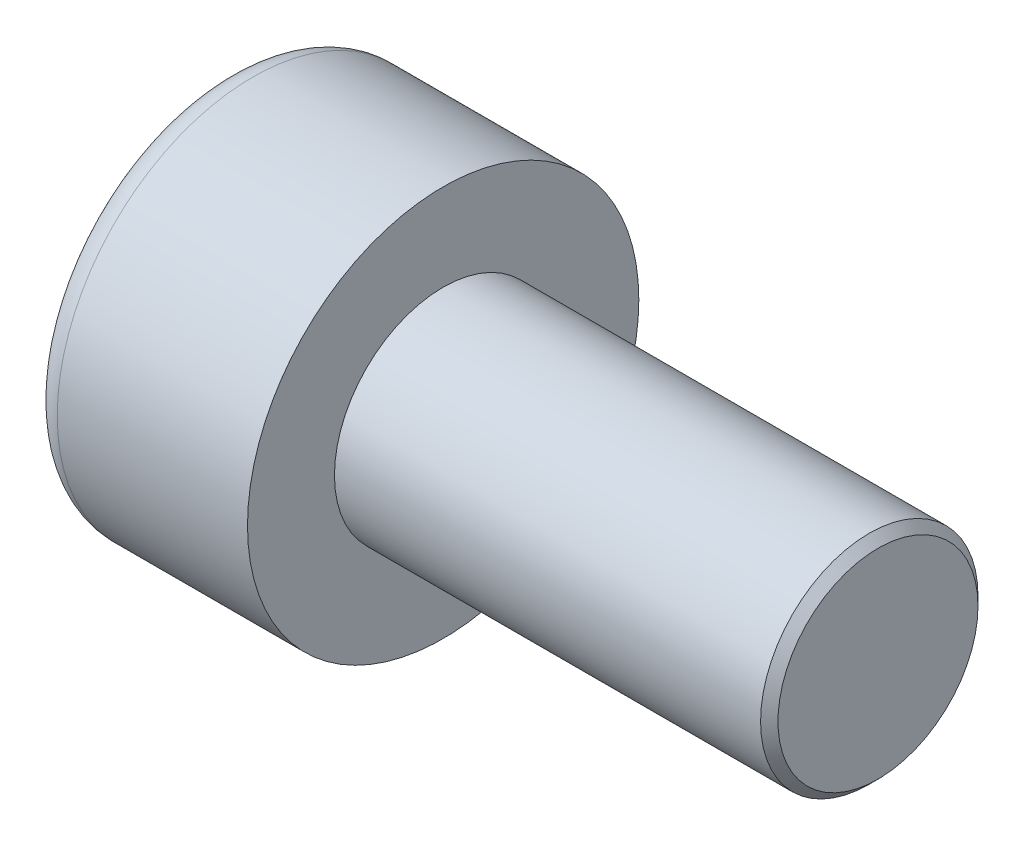
ISO-10303-21;
HEADER;
FILE_DESCRIPTION(('STEP AP214'),'2;1');
FILE_NAME('part.step','',(''),(''),'','','');
FILE_SCHEMA(('AUTOMOTIVE_DESIGN { 1 0 10303 214 1 1 1 1 }'));
ENDSEC;
DATA;
#1=APPLICATION_CONTEXT('core data for automotive mechanical design processes');
#2=APPLICATION_PROTOCOL_DEFINITION('international standard','automotive_design',2000,#1);
#3=PRODUCT_CONTEXT('',#1,'mechanical');
#4=PRODUCT('Part','Part','',(#3));
#5=PRODUCT_RELATED_PRODUCT_CATEGORY('part','',(#4));
#6=PRODUCT_DEFINITION_FORMATION('','',#4);
#7=PRODUCT_DEFINITION_CONTEXT('part definition',#1,'design');
#8=PRODUCT_DEFINITION('design','',#6,#7);
#9=PRODUCT_DEFINITION_SHAPE('','',#8);
#10=(LENGTH_UNIT() NAMED_UNIT(*) SI_UNIT(.MILLI.,.METRE.));
#11=(NAMED_UNIT(*) PLANE_ANGLE_UNIT() SI_UNIT($,.RADIAN.));
#12=(NAMED_UNIT(*) SI_UNIT($,.STERADIAN.) SOLID_ANGLE_UNIT());
#13=UNCERTAINTY_MEASURE_WITH_UNIT(LENGTH_MEASURE(1.E-05),#10,'distance_accuracy_value','');
#14=(GEOMETRIC_REPRESENTATION_CONTEXT(3) GLOBAL_UNCERTAINTY_ASSIGNED_CONTEXT((#13)) GLOBAL_UNIT_ASSIGNED_CONTEXT((#10,
#11,#12)) REPRESENTATION_CONTEXT('',''));
#15=CARTESIAN_POINT('',(0.,0.,0.));
#16=DIRECTION('',(0.,0.,1.));
#17=DIRECTION('',(1.,0.,0.));
#18=AXIS2_PLACEMENT_3D('',#15,#16,#17);
#19=CARTESIAN_POINT('',(1.10000000000003,0.,-1.15470053837931));
#20=DIRECTION('',(1.,0.,0.));
#21=DIRECTION('',(0.,0.,-1.));
#22=AXIS2_PLACEMENT_3D('',#19,#20,#21);
#23=PLANE('',#22);
#24=DIRECTION('',(0.,0.86602540378444,0.500000000000001));
#25=VECTOR('',#24,1.);
#26=CARTESIAN_POINT('',(1.10000000000003,0.,-1.15470053837931));
#27=LINE('',#26,#25);
#28=CARTESIAN_POINT('',(1.10000000000006,0.499999999999966,-0.866025403784443));
#29=VERTEX_POINT('',#28);
#30=CARTESIAN_POINT('',(1.10000000000008,0.999999999999925,-0.577350269189689));
#31=VERTEX_POINT('',#30);
#32=EDGE_CURVE('E394',#29,#31,#27,.T.);
#33=ORIENTED_EDGE('',*,*,#32,.F.);
#34=CARTESIAN_POINT('',(1.10000000000003,0.,0.));
#35=DIRECTION('',(1.,0.,0.));
#36=DIRECTION('',(0.,0.,-1.));
#37=AXIS2_PLACEMENT_3D('',#34,#35,#36);
#38=CIRCLE('',#37,1.);
#39=CARTESIAN_POINT('',(1.10000000000008,0.999999999999925,0.));
#40=VERTEX_POINT('',#39);
#41=EDGE_CURVE('E49',#29,#40,#38,.T.);
#42=ORIENTED_EDGE('',*,*,#41,.T.);
#43=DIRECTION('',(0.,0.,1.));
#44=VECTOR('',#43,1.);
#45=CARTESIAN_POINT('',(1.10000000000008,0.999999999999925,-0.577350269189689));
#46=LINE('',#45,#44);
#47=EDGE_CURVE('E338',#31,#40,#46,.T.);
#48=ORIENTED_EDGE('',*,*,#47,.F.);
#49=EDGE_LOOP('',(#33,#42,#48));
#50=FACE_BOUND('',#49,.T.);
#51=ADVANCED_FACE('F34',(#50),#23,.F.);
#52=CARTESIAN_POINT('',(1.10000000000008,0.999999999999938,0.57735026918955));
#53=VERTEX_POINT('',#52);
#54=EDGE_CURVE('E397',#40,#53,#46,.T.);
#55=ORIENTED_EDGE('',*,*,#54,.F.);
#56=CARTESIAN_POINT('',(1.10000000000004,0.499999999999966,0.866025403784415));
#57=VERTEX_POINT('',#56);
#58=EDGE_CURVE('E197',#40,#57,#38,.T.);
#59=ORIENTED_EDGE('',*,*,#58,.T.);
#60=DIRECTION('',(0.,-0.86602540378444,0.500000000000001));
#61=VECTOR('',#60,1.);
#62=CARTESIAN_POINT('',(1.10000000000008,0.999999999999938,0.57735026918955));
#63=LINE('',#62,#61);
#64=EDGE_CURVE('E337',#53,#57,#63,.T.);
#65=ORIENTED_EDGE('',*,*,#64,.F.);
#66=EDGE_LOOP('',(#55,#59,#65));
#67=FACE_BOUND('',#66,.T.);
#68=ADVANCED_FACE('F123',(#67),#23,.F.);
#69=CARTESIAN_POINT('',(1.10000000000003,0.,1.15470053837927));
#70=VERTEX_POINT('',#69);
#71=EDGE_CURVE('E330',#57,#70,#63,.T.);
#72=ORIENTED_EDGE('',*,*,#71,.F.);
#73=CARTESIAN_POINT('',(1.10000000000003,-0.500000000000065,0.866025403784526));
#74=VERTEX_POINT('',#73);
#75=EDGE_CURVE('E332',#57,#74,#38,.T.);
#76=ORIENTED_EDGE('',*,*,#75,.T.);
#77=DIRECTION('',(0.,-0.86602540378444,-0.500000000000001));
#78=VECTOR('',#77,1.);
#79=CARTESIAN_POINT('',(1.10000000000003,0.,1.15470053837927));
#80=LINE('',#79,#78);
#81=EDGE_CURVE('E335',#70,#74,#80,.T.);
#82=ORIENTED_EDGE('',*,*,#81,.F.);
#83=EDGE_LOOP('',(#72,#76,#82));
#84=FACE_BOUND('',#83,.T.);
#85=ADVANCED_FACE('F128',(#84),#23,.F.);
#86=CARTESIAN_POINT('',(1.10000000000003,-1.00000000000011,0.577350269189703));
#87=VERTEX_POINT('',#86);
#88=EDGE_CURVE('E346',#74,#87,#80,.T.);
#89=ORIENTED_EDGE('',*,*,#88,.F.);
#90=CARTESIAN_POINT('',(1.10000000000003,-1.00000000000008,0.));
#91=VERTEX_POINT('',#90);
#92=EDGE_CURVE('E402',#74,#91,#38,.T.);
#93=ORIENTED_EDGE('',*,*,#92,.T.);
#94=DIRECTION('',(0.,0.,-1.));
#95=VECTOR('',#94,1.);
#96=CARTESIAN_POINT('',(1.10000000000003,-1.00000000000011,0.577350269189703));
#97=LINE('',#96,#95);
#98=EDGE_CURVE('E352',#87,#91,#97,.T.);
#99=ORIENTED_EDGE('',*,*,#98,.F.);
#100=EDGE_LOOP('',(#89,#93,#99));
#101=FACE_BOUND('',#100,.T.);
#102=ADVANCED_FACE('F298',(#101),#23,.F.);
#103=CARTESIAN_POINT('',(1.10000000000003,-1.00000000000008,-0.577350269189578));
#104=VERTEX_POINT('',#103);
#105=EDGE_CURVE('E351',#91,#104,#97,.T.);
#106=ORIENTED_EDGE('',*,*,#105,.F.);
#107=CARTESIAN_POINT('',(1.10000000000003,-0.500000000000078,-0.86602540378436));
#108=VERTEX_POINT('',#107);
#109=EDGE_CURVE('E188',#91,#108,#38,.T.);
#110=ORIENTED_EDGE('',*,*,#109,.T.);
#111=DIRECTION('',(0.,0.866025403784439,-0.500000000000001));
#112=VECTOR('',#111,1.);
#113=CARTESIAN_POINT('',(1.10000000000003,-1.00000000000008,-0.577350269189578));
#114=LINE('',#113,#112);
#115=EDGE_CURVE('E392',#104,#108,#114,.T.);
#116=ORIENTED_EDGE('',*,*,#115,.F.);
#117=EDGE_LOOP('',(#106,#110,#116));
#118=FACE_BOUND('',#117,.T.);
#119=ADVANCED_FACE('F121',(#118),#23,.F.);
#120=CARTESIAN_POINT('',(0.,0.,0.));
#121=DIRECTION('',(1.,0.,0.));
#122=DIRECTION('',(0.,0.,-1.));
#123=AXIS2_PLACEMENT_3D('',#120,#121,#122);
#124=PLANE('',#123);
#125=CARTESIAN_POINT('',(0.,0.,0.));
#126=DIRECTION('',(1.,0.,0.));
#127=DIRECTION('',(0.,0.,-1.));
#128=AXIS2_PLACEMENT_3D('',#125,#126,#127);
#129=CIRCLE('',#128,1.9375);
#130=CARTESIAN_POINT('',(0.,0.,-1.93749999999999));
#131=VERTEX_POINT('',#130);
#132=EDGE_CURVE('E196',#131,#131,#129,.F.);
#133=ORIENTED_EDGE('',*,*,#132,.T.);
#134=EDGE_LOOP('',(#133));
#135=FACE_BOUND('',#134,.T.);
#136=DIRECTION('',(0.,0.866025403784439,-0.500000000000001));
#137=VECTOR('',#136,1.);
#138=CARTESIAN_POINT('',(0.,-1.00000000000006,-0.577350269189481));
#139=LINE('',#138,#137);
#140=CARTESIAN_POINT('',(0.,-1.00000000000006,-0.577350269189481));
#141=VERTEX_POINT('',#140);
#142=CARTESIAN_POINT('',(0.,0.,-1.15470053837924));
#143=VERTEX_POINT('',#142);
#144=EDGE_CURVE('E57',#141,#143,#139,.T.);
#145=ORIENTED_EDGE('',*,*,#144,.T.);
#146=DIRECTION('',(0.,0.86602540378444,0.500000000000001));
#147=VECTOR('',#146,1.);
#148=CARTESIAN_POINT('',(0.,0.,-1.15470053837924));
#149=LINE('',#148,#147);
#150=CARTESIAN_POINT('',(0.,0.999999999999942,-0.577350269189661));
#151=VERTEX_POINT('',#150);
#152=EDGE_CURVE('E357',#143,#151,#149,.T.);
#153=ORIENTED_EDGE('',*,*,#152,.T.);
#154=DIRECTION('',(0.,0.,1.));
#155=VECTOR('',#154,1.);
#156=CARTESIAN_POINT('',(0.,0.999999999999942,-0.577350269189661));
#157=LINE('',#156,#155);
#158=CARTESIAN_POINT('',(0.,1.00000000000001,0.577350269189633));
#159=VERTEX_POINT('',#158);
#160=EDGE_CURVE('E360',#151,#159,#157,.T.);
#161=ORIENTED_EDGE('',*,*,#160,.T.);
#162=DIRECTION('',(0.,-0.86602540378444,0.500000000000001));
#163=VECTOR('',#162,1.);
#164=CARTESIAN_POINT('',(0.,1.00000000000001,0.577350269189633));
#165=LINE('',#164,#163);
#166=CARTESIAN_POINT('',(0.,0.,1.15470053837927));
#167=VERTEX_POINT('',#166);
#168=EDGE_CURVE('E363',#159,#167,#165,.T.);
#169=ORIENTED_EDGE('',*,*,#168,.T.);
#170=DIRECTION('',(0.,-0.86602540378444,-0.500000000000001));
#171=VECTOR('',#170,1.);
#172=CARTESIAN_POINT('',(0.,0.,1.15470053837927));
#173=LINE('',#172,#171);
#174=CARTESIAN_POINT('',(0.,-1.00000000000002,0.577350269189703));
#175=VERTEX_POINT('',#174);
#176=EDGE_CURVE('E366',#167,#175,#173,.T.);
#177=ORIENTED_EDGE('',*,*,#176,.T.);
#178=DIRECTION('',(0.,0.,-1.));
#179=VECTOR('',#178,1.);
#180=CARTESIAN_POINT('',(0.,-1.00000000000002,0.577350269189703));
#181=LINE('',#180,#179);
#182=EDGE_CURVE('E369',#175,#141,#181,.T.);
#183=ORIENTED_EDGE('',*,*,#182,.T.);
#184=EDGE_LOOP('',(#145,#153,#161,#169,#177,#183));
#185=FACE_BOUND('',#184,.T.);
#186=ADVANCED_FACE('F166',(#135,#185),#124,.F.);
#187=CARTESIAN_POINT('',(2.50000000000004,0.,0.));
#188=DIRECTION('',(1.,0.,0.));
#189=DIRECTION('',(0.,0.,-1.));
#190=AXIS2_PLACEMENT_3D('',#187,#188,#189);
#191=PLANE('',#190);
#192=CARTESIAN_POINT('',(2.50000000000004,0.,0.));
#193=DIRECTION('',(1.,0.,0.));
#194=DIRECTION('',(0.,0.,-1.));
#195=AXIS2_PLACEMENT_3D('',#192,#193,#194);
#196=CIRCLE('',#195,2.25);
#197=CARTESIAN_POINT('',(2.50000000000004,0.,-2.25));
#198=VERTEX_POINT('',#197);
#199=EDGE_CURVE('E181',#198,#198,#196,.T.);
#200=ORIENTED_EDGE('',*,*,#199,.T.);
#201=EDGE_LOOP('',(#200));
#202=FACE_BOUND('',#201,.T.);
#203=CARTESIAN_POINT('',(2.50000000000004,0.,0.));
#204=DIRECTION('',(1.,0.,0.));
#205=DIRECTION('',(0.,0.,-1.));
#206=AXIS2_PLACEMENT_3D('',#203,#204,#205);
#207=CIRCLE('',#206,1.25);
#208=CARTESIAN_POINT('',(2.50000000000004,0.,-1.25));
#209=VERTEX_POINT('',#208);
#210=EDGE_CURVE('E184',#209,#209,#207,.T.);
#211=ORIENTED_EDGE('',*,*,#210,.F.);
#212=EDGE_LOOP('',(#211));
#213=FACE_BOUND('',#212,.T.);
#214=ADVANCED_FACE('F163',(#202,#213),#191,.T.);
#215=CARTESIAN_POINT('',(2.50000000000004,0.,0.));
#216=DIRECTION('',(-1.,0.,0.));
#217=DIRECTION('',(0.,0.,1.));
#218=AXIS2_PLACEMENT_3D('',#215,#216,#217);
#219=CYLINDRICAL_SURFACE('',#218,2.25);
#220=CARTESIAN_POINT('',(0.312500000000035,0.,0.));
#221=DIRECTION('',(1.,0.,0.));
#222=DIRECTION('',(0.,0.,-1.));
#223=AXIS2_PLACEMENT_3D('',#220,#221,#222);
#224=CIRCLE('',#223,2.25);
#225=CARTESIAN_POINT('',(0.312500000000035,0.,-2.25));
#226=VERTEX_POINT('',#225);
#227=EDGE_CURVE('E178',#226,#226,#224,.T.);
#228=ORIENTED_EDGE('',*,*,#227,.T.);
#229=EDGE_LOOP('',(#228));
#230=FACE_BOUND('',#229,.T.);
#231=ORIENTED_EDGE('',*,*,#199,.F.);
#232=EDGE_LOOP('',(#231));
#233=FACE_BOUND('',#232,.T.);
#234=ADVANCED_FACE('F161',(#230,#233),#219,.T.);
#235=CARTESIAN_POINT('',(7.50000000000003,0.,2.91433543964104E-13));
#236=DIRECTION('',(-1.,0.,0.));
#237=DIRECTION('',(0.,0.,1.));
#238=AXIS2_PLACEMENT_3D('',#235,#236,#237);
#239=CYLINDRICAL_SURFACE('',#238,1.25);
#240=CARTESIAN_POINT('',(7.40000000000003,0.,2.91433543964104E-13));
#241=DIRECTION('',(1.,0.,0.));
#242=DIRECTION('',(0.,0.,-1.));
#243=AXIS2_PLACEMENT_3D('',#240,#241,#242);
#244=CIRCLE('',#243,1.25);
#245=CARTESIAN_POINT('',(7.40000000000003,0.,-1.24999999999971));
#246=VERTEX_POINT('',#245);
#247=EDGE_CURVE('E11',#246,#246,#244,.F.);
#248=ORIENTED_EDGE('',*,*,#247,.T.);
#249=EDGE_LOOP('',(#248));
#250=FACE_BOUND('',#249,.T.);
#251=ORIENTED_EDGE('',*,*,#210,.T.);
#252=EDGE_LOOP('',(#251));
#253=FACE_BOUND('',#252,.T.);
#254=ADVANCED_FACE('F157',(#250,#253),#239,.T.);
#255=CARTESIAN_POINT('',(7.50000000000003,0.,2.91433543964104E-13));
#256=DIRECTION('',(1.,0.,0.));
#257=DIRECTION('',(0.,0.,-1.));
#258=AXIS2_PLACEMENT_3D('',#255,#256,#257);
#259=PLANE('',#258);
#260=CARTESIAN_POINT('',(7.50000000000003,0.,2.91433543964104E-13));
#261=DIRECTION('',(1.,0.,0.));
#262=DIRECTION('',(0.,0.,-1.));
#263=AXIS2_PLACEMENT_3D('',#260,#261,#262);
#264=CIRCLE('',#263,1.15);
#265=CARTESIAN_POINT('',(7.50000000000003,0.,-1.14999999999971));
#266=VERTEX_POINT('',#265);
#267=EDGE_CURVE('E42',#266,#266,#264,.T.);
#268=ORIENTED_EDGE('',*,*,#267,.T.);
#269=EDGE_LOOP('',(#268));
#270=FACE_BOUND('',#269,.T.);
#271=ADVANCED_FACE('F154',(#270),#259,.T.);
#272=CARTESIAN_POINT('',(1.10000000000003,-1.00000000000008,-0.577350269189578));
#273=DIRECTION('',(0.,0.500000000000001,0.86602540378444));
#274=DIRECTION('',(0.,-0.866025403784439,0.500000000000001));
#275=AXIS2_PLACEMENT_3D('',#272,#273,#274);
#276=PLANE('',#275);
#277=ORIENTED_EDGE('',*,*,#144,.F.);
#278=DIRECTION('',(-1.,0.,0.));
#279=VECTOR('',#278,1.);
#280=CARTESIAN_POINT('',(1.10000000000003,-1.00000000000008,-0.577350269189578));
#281=LINE('',#280,#279);
#282=EDGE_CURVE('E355',#104,#141,#281,.T.);
#283=ORIENTED_EDGE('',*,*,#282,.F.);
#284=ORIENTED_EDGE('',*,*,#115,.T.);
#285=CARTESIAN_POINT('',(1.10000000000003,0.,-1.15470053837931));
#286=VERTEX_POINT('',#285);
#287=EDGE_CURVE('E372',#108,#286,#114,.T.);
#288=ORIENTED_EDGE('',*,*,#287,.T.);
#289=DIRECTION('',(-1.,0.,0.));
#290=VECTOR('',#289,1.);
#291=CARTESIAN_POINT('',(1.10000000000003,0.,-1.15470053837931));
#292=LINE('',#291,#290);
#293=EDGE_CURVE('E191',#286,#143,#292,.T.);
#294=ORIENTED_EDGE('',*,*,#293,.T.);
#295=EDGE_LOOP('',(#277,#283,#284,#288,#294));
#296=FACE_BOUND('',#295,.T.);
#297=ADVANCED_FACE('F150',(#296),#276,.T.);
#298=CARTESIAN_POINT('',(1.10000000000003,0.,-1.15470053837931));
#299=DIRECTION('',(0.,-0.500000000000001,0.86602540378444));
#300=DIRECTION('',(0.,-0.86602540378444,-0.500000000000001));
#301=AXIS2_PLACEMENT_3D('',#298,#299,#300);
#302=PLANE('',#301);
#303=ORIENTED_EDGE('',*,*,#152,.F.);
#304=ORIENTED_EDGE('',*,*,#293,.F.);
#305=EDGE_CURVE('E396',#286,#29,#27,.T.);
#306=ORIENTED_EDGE('',*,*,#305,.T.);
#307=ORIENTED_EDGE('',*,*,#32,.T.);
#308=DIRECTION('',(-1.,0.,0.));
#309=VECTOR('',#308,1.);
#310=CARTESIAN_POINT('',(1.10000000000008,0.999999999999925,-0.577350269189689));
#311=LINE('',#310,#309);
#312=EDGE_CURVE('E379',#31,#151,#311,.T.);
#313=ORIENTED_EDGE('',*,*,#312,.T.);
#314=EDGE_LOOP('',(#303,#304,#306,#307,#313));
#315=FACE_BOUND('',#314,.T.);
#316=ADVANCED_FACE('F146',(#315),#302,.T.);
#317=CARTESIAN_POINT('',(1.10000000000008,0.999999999999925,-0.577350269189689));
#318=DIRECTION('',(0.,-1.,0.));
#319=DIRECTION('',(0.,0.,-1.));
#320=AXIS2_PLACEMENT_3D('',#317,#318,#319);
#321=PLANE('',#320);
#322=ORIENTED_EDGE('',*,*,#160,.F.);
#323=ORIENTED_EDGE('',*,*,#312,.F.);
#324=ORIENTED_EDGE('',*,*,#47,.T.);
#325=ORIENTED_EDGE('',*,*,#54,.T.);
#326=DIRECTION('',(-1.,0.,0.));
#327=VECTOR('',#326,1.);
#328=CARTESIAN_POINT('',(1.10000000000008,0.999999999999938,0.57735026918955));
#329=LINE('',#328,#327);
#330=EDGE_CURVE('E343',#53,#159,#329,.T.);
#331=ORIENTED_EDGE('',*,*,#330,.T.);
#332=EDGE_LOOP('',(#322,#323,#324,#325,#331));
#333=FACE_BOUND('',#332,.T.);
#334=ADVANCED_FACE('F142',(#333),#321,.T.);
#335=CARTESIAN_POINT('',(1.10000000000008,0.999999999999938,0.57735026918955));
#336=DIRECTION('',(0.,-0.500000000000001,-0.86602540378444));
#337=DIRECTION('',(0.,0.86602540378444,-0.500000000000001));
#338=AXIS2_PLACEMENT_3D('',#335,#336,#337);
#339=PLANE('',#338);
#340=ORIENTED_EDGE('',*,*,#168,.F.);
#341=ORIENTED_EDGE('',*,*,#330,.F.);
#342=ORIENTED_EDGE('',*,*,#64,.T.);
#343=ORIENTED_EDGE('',*,*,#71,.T.);
#344=DIRECTION('',(-1.,0.,0.));
#345=VECTOR('',#344,1.);
#346=CARTESIAN_POINT('',(1.10000000000003,0.,1.15470053837927));
#347=LINE('',#346,#345);
#348=EDGE_CURVE('E376',#70,#167,#347,.T.);
#349=ORIENTED_EDGE('',*,*,#348,.T.);
#350=EDGE_LOOP('',(#340,#341,#342,#343,#349));
#351=FACE_BOUND('',#350,.T.);
#352=ADVANCED_FACE('F138',(#351),#339,.T.);
#353=CARTESIAN_POINT('',(1.10000000000003,0.,1.15470053837927));
#354=DIRECTION('',(0.,0.500000000000001,-0.86602540378444));
#355=DIRECTION('',(0.,0.86602540378444,0.500000000000001));
#356=AXIS2_PLACEMENT_3D('',#353,#354,#355);
#357=PLANE('',#356);
#358=ORIENTED_EDGE('',*,*,#176,.F.);
#359=ORIENTED_EDGE('',*,*,#348,.F.);
#360=ORIENTED_EDGE('',*,*,#81,.T.);
#361=ORIENTED_EDGE('',*,*,#88,.T.);
#362=DIRECTION('',(-1.,0.,0.));
#363=VECTOR('',#362,1.);
#364=CARTESIAN_POINT('',(1.10000000000003,-1.00000000000011,0.577350269189703));
#365=LINE('',#364,#363);
#366=EDGE_CURVE('E374',#87,#175,#365,.T.);
#367=ORIENTED_EDGE('',*,*,#366,.T.);
#368=EDGE_LOOP('',(#358,#359,#360,#361,#367));
#369=FACE_BOUND('',#368,.T.);
#370=ADVANCED_FACE('F134',(#369),#357,.T.);
#371=CARTESIAN_POINT('',(1.10000000000003,-1.00000000000011,0.577350269189703));
#372=DIRECTION('',(0.,1.,0.));
#373=DIRECTION('',(0.,0.,1.));
#374=AXIS2_PLACEMENT_3D('',#371,#372,#373);
#375=PLANE('',#374);
#376=ORIENTED_EDGE('',*,*,#182,.F.);
#377=ORIENTED_EDGE('',*,*,#366,.F.);
#378=ORIENTED_EDGE('',*,*,#98,.T.);
#379=ORIENTED_EDGE('',*,*,#105,.T.);
#380=ORIENTED_EDGE('',*,*,#282,.T.);
#381=EDGE_LOOP('',(#376,#377,#378,#379,#380));
#382=FACE_BOUND('',#381,.T.);
#383=ADVANCED_FACE('F118',(#382),#375,.T.);
#384=ORIENTED_EDGE('',*,*,#287,.F.);
#385=EDGE_CURVE('E183',#108,#29,#38,.T.);
#386=ORIENTED_EDGE('',*,*,#385,.T.);
#387=ORIENTED_EDGE('',*,*,#305,.F.);
#388=EDGE_LOOP('',(#384,#386,#387));
#389=FACE_BOUND('',#388,.T.);
#390=ADVANCED_FACE('F111',(#389),#23,.F.);
#391=CARTESIAN_POINT('',(1.10000000000003,0.,0.));
#392=DIRECTION('',(-1.,0.,0.));
#393=DIRECTION('',(0.,0.,1.));
#394=AXIS2_PLACEMENT_3D('',#391,#392,#393);
#395=CONICAL_SURFACE('',#394,1.,1.04719755119659);
#396=CARTESIAN_POINT('',(1.67735026918966,0.,0.));
#397=VERTEX_POINT('',#396);
#398=VERTEX_LOOP('',#397);
#399=FACE_BOUND('',#398,.T.);
#400=ORIENTED_EDGE('',*,*,#41,.F.);
#401=ORIENTED_EDGE('',*,*,#385,.F.);
#402=ORIENTED_EDGE('',*,*,#109,.F.);
#403=ORIENTED_EDGE('',*,*,#92,.F.);
#404=ORIENTED_EDGE('',*,*,#75,.F.);
#405=ORIENTED_EDGE('',*,*,#58,.F.);
#406=EDGE_LOOP('',(#400,#401,#402,#403,#404,#405));
#407=FACE_BOUND('',#406,.T.);
#408=ADVANCED_FACE('F108',(#399,#407),#395,.F.);
#409=CARTESIAN_POINT('',(0.312500000000035,0.,0.));
#410=DIRECTION('',(1.,0.,0.));
#411=DIRECTION('',(0.,0.,-1.));
#412=AXIS2_PLACEMENT_3D('',#409,#410,#411);
#413=TOROIDAL_SURFACE('',#412,1.9375,0.3125);
#414=ORIENTED_EDGE('',*,*,#132,.F.);
#415=EDGE_LOOP('',(#414));
#416=FACE_BOUND('',#415,.T.);
#417=ORIENTED_EDGE('',*,*,#227,.F.);
#418=EDGE_LOOP('',(#417));
#419=FACE_BOUND('',#418,.T.);
#420=ADVANCED_FACE('F110',(#416,#419),#413,.T.);
#421=CARTESIAN_POINT('',(7.50000000000003,0.,2.91433543964104E-13));
#422=DIRECTION('',(-1.,0.,0.));
#423=DIRECTION('',(0.,0.,1.));
#424=AXIS2_PLACEMENT_3D('',#421,#422,#423);
#425=CONICAL_SURFACE('',#424,1.15,0.785398163397451);
#426=ORIENTED_EDGE('',*,*,#247,.F.);
#427=EDGE_LOOP('',(#426));
#428=FACE_BOUND('',#427,.T.);
#429=ORIENTED_EDGE('',*,*,#267,.F.);
#430=EDGE_LOOP('',(#429));
#431=FACE_BOUND('',#430,.T.);
#432=ADVANCED_FACE('F36',(#428,#431),#425,.T.);
#433=CLOSED_SHELL('',(#51,#68,#85,#102,#119,#186,#214,#234,#254,#271,#297,#316,#334,#352,#370,
#383,#390,#408,#420,#432));
#434=MANIFOLD_SOLID_BREP('B2',#433);
#435=ADVANCED_BREP_SHAPE_REPRESENTATION('',(#18,#434),#14);
#436=SHAPE_DEFINITION_REPRESENTATION(#9,#435);
ENDSEC;
END-ISO-10303-21;
